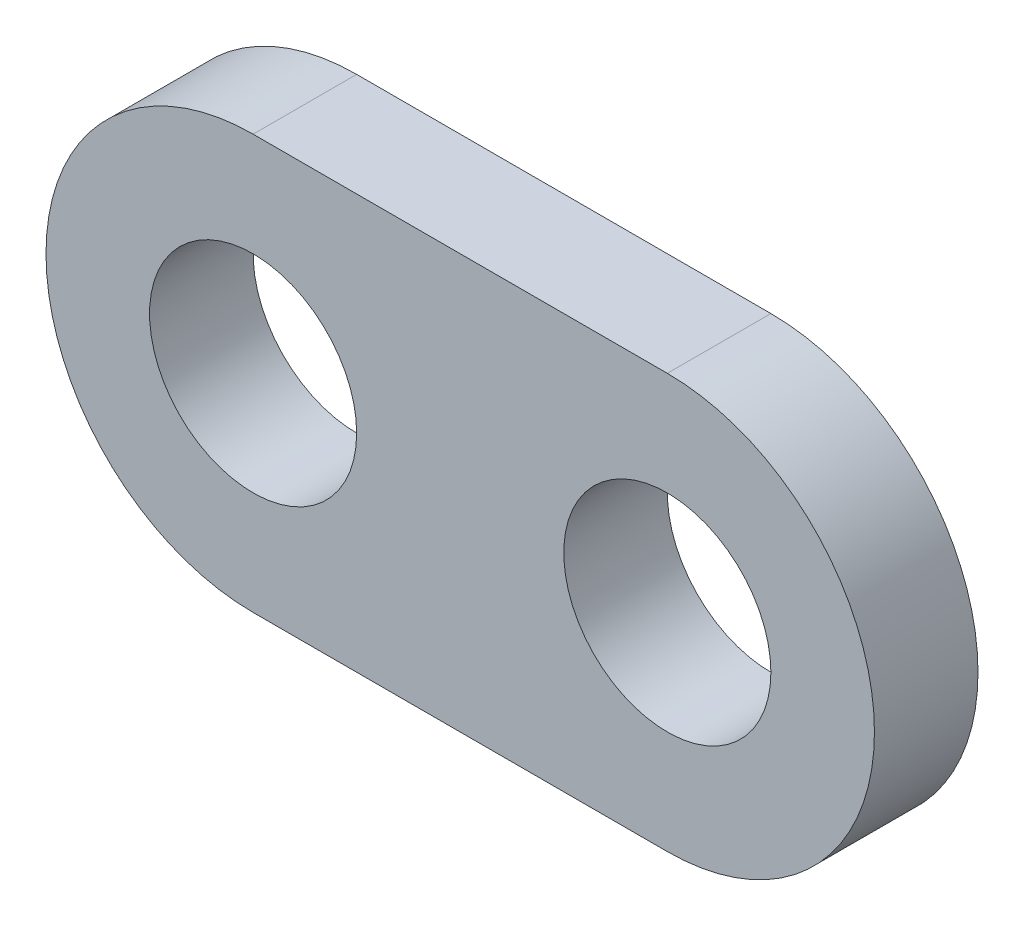
ISO-10303-21;
HEADER;
FILE_DESCRIPTION(('STEP AP214'),'2;1');
FILE_NAME('part.step','',(''),(''),'','','');
FILE_SCHEMA(('AUTOMOTIVE_DESIGN { 1 0 10303 214 1 1 1 1 }'));
ENDSEC;
DATA;
#1=APPLICATION_CONTEXT('core data for automotive mechanical design processes');
#2=APPLICATION_PROTOCOL_DEFINITION('international standard','automotive_design',2000,#1);
#3=PRODUCT_CONTEXT('',#1,'mechanical');
#4=PRODUCT('Part','Part','',(#3));
#5=PRODUCT_RELATED_PRODUCT_CATEGORY('part','',(#4));
#6=PRODUCT_DEFINITION_FORMATION('','',#4);
#7=PRODUCT_DEFINITION_CONTEXT('part definition',#1,'design');
#8=PRODUCT_DEFINITION('design','',#6,#7);
#9=PRODUCT_DEFINITION_SHAPE('','',#8);
#10=(LENGTH_UNIT() NAMED_UNIT(*) SI_UNIT(.MILLI.,.METRE.));
#11=(NAMED_UNIT(*) PLANE_ANGLE_UNIT() SI_UNIT($,.RADIAN.));
#12=(NAMED_UNIT(*) SI_UNIT($,.STERADIAN.) SOLID_ANGLE_UNIT());
#13=UNCERTAINTY_MEASURE_WITH_UNIT(LENGTH_MEASURE(1.E-05),#10,'distance_accuracy_value','');
#14=(GEOMETRIC_REPRESENTATION_CONTEXT(3) GLOBAL_UNCERTAINTY_ASSIGNED_CONTEXT((#13)) GLOBAL_UNIT_ASSIGNED_CONTEXT((#10,
#11,#12)) REPRESENTATION_CONTEXT('',''));
#15=CARTESIAN_POINT('',(0.,0.,0.));
#16=DIRECTION('',(0.,0.,1.));
#17=DIRECTION('',(1.,0.,0.));
#18=AXIS2_PLACEMENT_3D('',#15,#16,#17);
#19=CARTESIAN_POINT('',(0.,0.,5.));
#20=DIRECTION('',(0.,0.,1.));
#21=DIRECTION('',(1.,0.,0.));
#22=AXIS2_PLACEMENT_3D('',#19,#20,#21);
#23=PLANE('',#22);
#24=CARTESIAN_POINT('',(0.,0.,5.));
#25=DIRECTION('',(0.,0.,1.));
#26=DIRECTION('',(1.,0.,0.));
#27=AXIS2_PLACEMENT_3D('',#24,#25,#26);
#28=CIRCLE('',#27,5.);
#29=CARTESIAN_POINT('',(5.,0.,5.));
#30=VERTEX_POINT('',#29);
#31=EDGE_CURVE('E107',#30,#30,#28,.T.);
#32=ORIENTED_EDGE('',*,*,#31,.F.);
#33=EDGE_LOOP('',(#32));
#34=FACE_BOUND('',#33,.T.);
#35=CARTESIAN_POINT('',(0.,0.,5.));
#36=DIRECTION('',(0.,0.,1.));
#37=DIRECTION('',(1.,0.,0.));
#38=AXIS2_PLACEMENT_3D('',#35,#36,#37);
#39=CIRCLE('',#38,10.);
#40=CARTESIAN_POINT('',(0.,10.,5.));
#41=VERTEX_POINT('',#40);
#42=CARTESIAN_POINT('',(0.,-10.,5.));
#43=VERTEX_POINT('',#42);
#44=EDGE_CURVE('E91',#41,#43,#39,.T.);
#45=ORIENTED_EDGE('',*,*,#44,.T.);
#46=DIRECTION('',(1.,0.,0.));
#47=VECTOR('',#46,1.);
#48=CARTESIAN_POINT('',(0.,-10.,5.));
#49=LINE('',#48,#47);
#50=CARTESIAN_POINT('',(20.,-10.,5.));
#51=VERTEX_POINT('',#50);
#52=EDGE_CURVE('E86',#43,#51,#49,.T.);
#53=ORIENTED_EDGE('',*,*,#52,.T.);
#54=CARTESIAN_POINT('',(20.,0.,5.));
#55=DIRECTION('',(0.,0.,1.));
#56=DIRECTION('',(1.,0.,0.));
#57=AXIS2_PLACEMENT_3D('',#54,#55,#56);
#58=CIRCLE('',#57,10.);
#59=CARTESIAN_POINT('',(20.,10.,5.));
#60=VERTEX_POINT('',#59);
#61=EDGE_CURVE('E87',#51,#60,#58,.T.);
#62=ORIENTED_EDGE('',*,*,#61,.T.);
#63=DIRECTION('',(-1.,0.,0.));
#64=VECTOR('',#63,1.);
#65=CARTESIAN_POINT('',(0.,10.,5.));
#66=LINE('',#65,#64);
#67=EDGE_CURVE('E57',#60,#41,#66,.T.);
#68=ORIENTED_EDGE('',*,*,#67,.T.);
#69=EDGE_LOOP('',(#45,#53,#62,#68));
#70=FACE_BOUND('',#69,.T.);
#71=CARTESIAN_POINT('',(20.,0.,5.));
#72=DIRECTION('',(0.,0.,1.));
#73=DIRECTION('',(1.,0.,0.));
#74=AXIS2_PLACEMENT_3D('',#71,#72,#73);
#75=CIRCLE('',#74,5.);
#76=CARTESIAN_POINT('',(25.,0.,5.));
#77=VERTEX_POINT('',#76);
#78=EDGE_CURVE('E123',#77,#77,#75,.T.);
#79=ORIENTED_EDGE('',*,*,#78,.F.);
#80=EDGE_LOOP('',(#79));
#81=FACE_BOUND('',#80,.T.);
#82=ADVANCED_FACE('F39',(#34,#70,#81),#23,.T.);
#83=CARTESIAN_POINT('',(0.,0.,0.));
#84=DIRECTION('',(0.,0.,1.));
#85=DIRECTION('',(1.,0.,0.));
#86=AXIS2_PLACEMENT_3D('',#83,#84,#85);
#87=PLANE('',#86);
#88=CARTESIAN_POINT('',(0.,0.,0.));
#89=DIRECTION('',(0.,0.,1.));
#90=DIRECTION('',(1.,0.,0.));
#91=AXIS2_PLACEMENT_3D('',#88,#89,#90);
#92=CIRCLE('',#91,10.);
#93=CARTESIAN_POINT('',(0.,10.,0.));
#94=VERTEX_POINT('',#93);
#95=CARTESIAN_POINT('',(0.,-10.,0.));
#96=VERTEX_POINT('',#95);
#97=EDGE_CURVE('E104',#94,#96,#92,.T.);
#98=ORIENTED_EDGE('',*,*,#97,.F.);
#99=DIRECTION('',(-1.,0.,0.));
#100=VECTOR('',#99,1.);
#101=CARTESIAN_POINT('',(0.,10.,0.));
#102=LINE('',#101,#100);
#103=CARTESIAN_POINT('',(20.,10.,0.));
#104=VERTEX_POINT('',#103);
#105=EDGE_CURVE('E80',#104,#94,#102,.T.);
#106=ORIENTED_EDGE('',*,*,#105,.F.);
#107=CARTESIAN_POINT('',(20.,0.,0.));
#108=DIRECTION('',(0.,0.,1.));
#109=DIRECTION('',(1.,0.,0.));
#110=AXIS2_PLACEMENT_3D('',#107,#108,#109);
#111=CIRCLE('',#110,10.);
#112=CARTESIAN_POINT('',(20.,-10.,0.));
#113=VERTEX_POINT('',#112);
#114=EDGE_CURVE('E75',#113,#104,#111,.T.);
#115=ORIENTED_EDGE('',*,*,#114,.F.);
#116=DIRECTION('',(1.,0.,0.));
#117=VECTOR('',#116,1.);
#118=CARTESIAN_POINT('',(0.,-10.,0.));
#119=LINE('',#118,#117);
#120=EDGE_CURVE('E94',#96,#113,#119,.T.);
#121=ORIENTED_EDGE('',*,*,#120,.F.);
#122=EDGE_LOOP('',(#98,#106,#115,#121));
#123=FACE_BOUND('',#122,.T.);
#124=CARTESIAN_POINT('',(0.,0.,0.));
#125=DIRECTION('',(0.,0.,1.));
#126=DIRECTION('',(1.,0.,0.));
#127=AXIS2_PLACEMENT_3D('',#124,#125,#126);
#128=CIRCLE('',#127,5.);
#129=CARTESIAN_POINT('',(5.,0.,0.));
#130=VERTEX_POINT('',#129);
#131=EDGE_CURVE('E120',#130,#130,#128,.T.);
#132=ORIENTED_EDGE('',*,*,#131,.T.);
#133=EDGE_LOOP('',(#132));
#134=FACE_BOUND('',#133,.T.);
#135=CARTESIAN_POINT('',(20.,0.,0.));
#136=DIRECTION('',(0.,0.,1.));
#137=DIRECTION('',(1.,0.,0.));
#138=AXIS2_PLACEMENT_3D('',#135,#136,#137);
#139=CIRCLE('',#138,5.);
#140=CARTESIAN_POINT('',(25.,0.,0.));
#141=VERTEX_POINT('',#140);
#142=EDGE_CURVE('E125',#141,#141,#139,.T.);
#143=ORIENTED_EDGE('',*,*,#142,.T.);
#144=EDGE_LOOP('',(#143));
#145=FACE_BOUND('',#144,.T.);
#146=ADVANCED_FACE('F114',(#123,#134,#145),#87,.F.);
#147=CARTESIAN_POINT('',(0.,0.,5.));
#148=DIRECTION('',(0.,0.,-1.));
#149=DIRECTION('',(-1.,0.,0.));
#150=AXIS2_PLACEMENT_3D('',#147,#148,#149);
#151=CYLINDRICAL_SURFACE('',#150,10.);
#152=ORIENTED_EDGE('',*,*,#97,.T.);
#153=DIRECTION('',(0.,0.,-1.));
#154=VECTOR('',#153,1.);
#155=CARTESIAN_POINT('',(0.,-10.,5.));
#156=LINE('',#155,#154);
#157=EDGE_CURVE('E11',#43,#96,#156,.T.);
#158=ORIENTED_EDGE('',*,*,#157,.F.);
#159=ORIENTED_EDGE('',*,*,#44,.F.);
#160=DIRECTION('',(0.,0.,-1.));
#161=VECTOR('',#160,1.);
#162=CARTESIAN_POINT('',(0.,10.,5.));
#163=LINE('',#162,#161);
#164=EDGE_CURVE('E98',#41,#94,#163,.T.);
#165=ORIENTED_EDGE('',*,*,#164,.T.);
#166=EDGE_LOOP('',(#152,#158,#159,#165));
#167=FACE_BOUND('',#166,.T.);
#168=ADVANCED_FACE('F41',(#167),#151,.T.);
#169=CARTESIAN_POINT('',(0.,-10.,5.));
#170=DIRECTION('',(0.,1.,0.));
#171=DIRECTION('',(0.,0.,1.));
#172=AXIS2_PLACEMENT_3D('',#169,#170,#171);
#173=PLANE('',#172);
#174=ORIENTED_EDGE('',*,*,#120,.T.);
#175=DIRECTION('',(0.,0.,-1.));
#176=VECTOR('',#175,1.);
#177=CARTESIAN_POINT('',(20.,-10.,5.));
#178=LINE('',#177,#176);
#179=EDGE_CURVE('E48',#51,#113,#178,.T.);
#180=ORIENTED_EDGE('',*,*,#179,.F.);
#181=ORIENTED_EDGE('',*,*,#52,.F.);
#182=ORIENTED_EDGE('',*,*,#157,.T.);
#183=EDGE_LOOP('',(#174,#180,#181,#182));
#184=FACE_BOUND('',#183,.T.);
#185=ADVANCED_FACE('F92',(#184),#173,.F.);
#186=CARTESIAN_POINT('',(20.,0.,5.));
#187=DIRECTION('',(0.,0.,-1.));
#188=DIRECTION('',(-1.,0.,0.));
#189=AXIS2_PLACEMENT_3D('',#186,#187,#188);
#190=CYLINDRICAL_SURFACE('',#189,10.);
#191=ORIENTED_EDGE('',*,*,#114,.T.);
#192=DIRECTION('',(0.,0.,-1.));
#193=VECTOR('',#192,1.);
#194=CARTESIAN_POINT('',(20.,10.,5.));
#195=LINE('',#194,#193);
#196=EDGE_CURVE('E96',#60,#104,#195,.T.);
#197=ORIENTED_EDGE('',*,*,#196,.F.);
#198=ORIENTED_EDGE('',*,*,#61,.F.);
#199=ORIENTED_EDGE('',*,*,#179,.T.);
#200=EDGE_LOOP('',(#191,#197,#198,#199));
#201=FACE_BOUND('',#200,.T.);
#202=ADVANCED_FACE('F100',(#201),#190,.T.);
#203=CARTESIAN_POINT('',(0.,10.,5.));
#204=DIRECTION('',(0.,-1.,0.));
#205=DIRECTION('',(0.,0.,-1.));
#206=AXIS2_PLACEMENT_3D('',#203,#204,#205);
#207=PLANE('',#206);
#208=ORIENTED_EDGE('',*,*,#105,.T.);
#209=ORIENTED_EDGE('',*,*,#164,.F.);
#210=ORIENTED_EDGE('',*,*,#67,.F.);
#211=ORIENTED_EDGE('',*,*,#196,.T.);
#212=EDGE_LOOP('',(#208,#209,#210,#211));
#213=FACE_BOUND('',#212,.T.);
#214=ADVANCED_FACE('F112',(#213),#207,.F.);
#215=CARTESIAN_POINT('',(0.,0.,5.));
#216=DIRECTION('',(0.,0.,-1.));
#217=DIRECTION('',(-1.,0.,0.));
#218=AXIS2_PLACEMENT_3D('',#215,#216,#217);
#219=CYLINDRICAL_SURFACE('',#218,5.);
#220=ORIENTED_EDGE('',*,*,#31,.T.);
#221=EDGE_LOOP('',(#220));
#222=FACE_BOUND('',#221,.T.);
#223=ORIENTED_EDGE('',*,*,#131,.F.);
#224=EDGE_LOOP('',(#223));
#225=FACE_BOUND('',#224,.T.);
#226=ADVANCED_FACE('F141',(#222,#225),#219,.F.);
#227=CARTESIAN_POINT('',(20.,0.,5.));
#228=DIRECTION('',(0.,0.,-1.));
#229=DIRECTION('',(-1.,0.,0.));
#230=AXIS2_PLACEMENT_3D('',#227,#228,#229);
#231=CYLINDRICAL_SURFACE('',#230,5.);
#232=ORIENTED_EDGE('',*,*,#78,.T.);
#233=EDGE_LOOP('',(#232));
#234=FACE_BOUND('',#233,.T.);
#235=ORIENTED_EDGE('',*,*,#142,.F.);
#236=EDGE_LOOP('',(#235));
#237=FACE_BOUND('',#236,.T.);
#238=ADVANCED_FACE('F127',(#234,#237),#231,.F.);
#239=CLOSED_SHELL('',(#82,#146,#168,#185,#202,#214,#226,#238));
#240=MANIFOLD_SOLID_BREP('B2',#239);
#241=ADVANCED_BREP_SHAPE_REPRESENTATION('',(#18,#240),#14);
#242=SHAPE_DEFINITION_REPRESENTATION(#9,#241);
ENDSEC;
END-ISO-10303-21;
